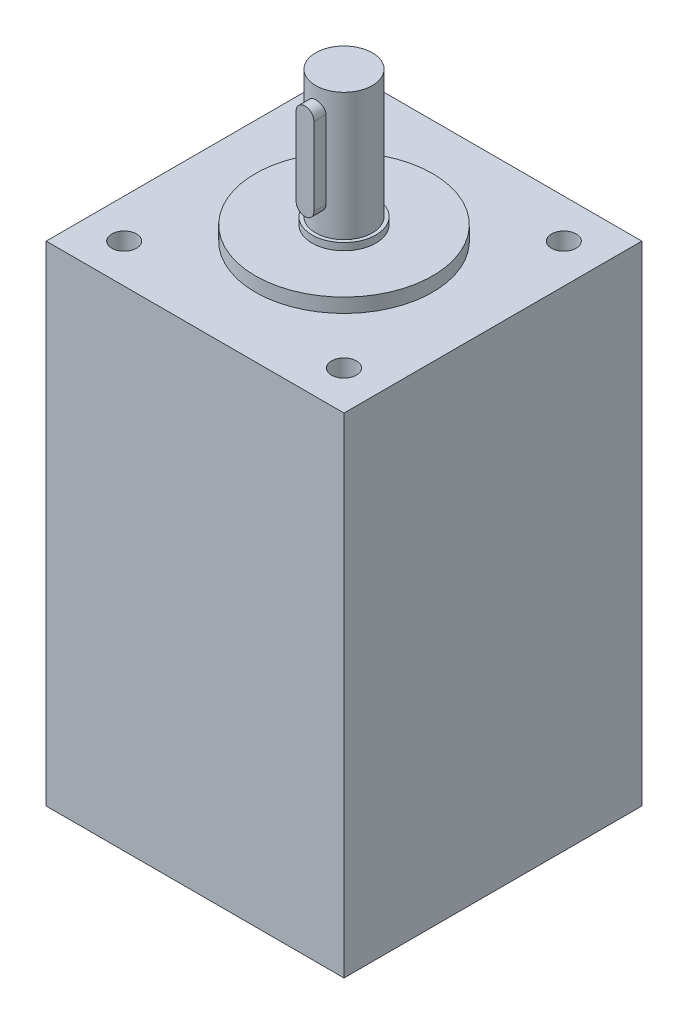
ISO-10303-21;
HEADER;
FILE_DESCRIPTION(('STEP AP214'),'2;1');
FILE_NAME('part.step','',(''),(''),'','','');
FILE_SCHEMA(('AUTOMOTIVE_DESIGN { 1 0 10303 214 1 1 1 1 }'));
ENDSEC;
DATA;
#1=APPLICATION_CONTEXT('core data for automotive mechanical design processes');
#2=APPLICATION_PROTOCOL_DEFINITION('international standard','automotive_design',2000,#1);
#3=PRODUCT_CONTEXT('',#1,'mechanical');
#4=PRODUCT('Part','Part','',(#3));
#5=PRODUCT_RELATED_PRODUCT_CATEGORY('part','',(#4));
#6=PRODUCT_DEFINITION_FORMATION('','',#4);
#7=PRODUCT_DEFINITION_CONTEXT('part definition',#1,'design');
#8=PRODUCT_DEFINITION('design','',#6,#7);
#9=PRODUCT_DEFINITION_SHAPE('','',#8);
#10=(LENGTH_UNIT() NAMED_UNIT(*) SI_UNIT(.MILLI.,.METRE.));
#11=(NAMED_UNIT(*) PLANE_ANGLE_UNIT() SI_UNIT($,.RADIAN.));
#12=(NAMED_UNIT(*) SI_UNIT($,.STERADIAN.) SOLID_ANGLE_UNIT());
#13=UNCERTAINTY_MEASURE_WITH_UNIT(LENGTH_MEASURE(1.E-05),#10,'distance_accuracy_value','');
#14=(GEOMETRIC_REPRESENTATION_CONTEXT(3) GLOBAL_UNCERTAINTY_ASSIGNED_CONTEXT((#13)) GLOBAL_UNIT_ASSIGNED_CONTEXT((#10,
#11,#12)) REPRESENTATION_CONTEXT('',''));
#15=CARTESIAN_POINT('',(0.,0.,0.));
#16=DIRECTION('',(0.,0.,1.));
#17=DIRECTION('',(1.,0.,0.));
#18=AXIS2_PLACEMENT_3D('',#15,#16,#17);
#19=CARTESIAN_POINT('',(0.,69.,0.));
#20=DIRECTION('',(1.,0.,0.));
#21=DIRECTION('',(0.,0.,-1.));
#22=AXIS2_PLACEMENT_3D('',#19,#20,#21);
#23=PLANE('',#22);
#24=DIRECTION('',(0.,0.,1.));
#25=VECTOR('',#24,1.);
#26=CARTESIAN_POINT('',(0.,0.,0.));
#27=LINE('',#26,#25);
#28=CARTESIAN_POINT('',(0.,0.,-42.));
#29=VERTEX_POINT('',#28);
#30=CARTESIAN_POINT('',(0.,0.,0.));
#31=VERTEX_POINT('',#30);
#32=EDGE_CURVE('E165',#29,#31,#27,.T.);
#33=ORIENTED_EDGE('',*,*,#32,.T.);
#34=DIRECTION('',(0.,-1.,0.));
#35=VECTOR('',#34,1.);
#36=CARTESIAN_POINT('',(0.,69.,0.));
#37=LINE('',#36,#35);
#38=CARTESIAN_POINT('',(0.,69.,0.));
#39=VERTEX_POINT('',#38);
#40=EDGE_CURVE('E168',#39,#31,#37,.T.);
#41=ORIENTED_EDGE('',*,*,#40,.F.);
#42=DIRECTION('',(0.,0.,1.));
#43=VECTOR('',#42,1.);
#44=CARTESIAN_POINT('',(0.,69.,0.));
#45=LINE('',#44,#43);
#46=CARTESIAN_POINT('',(0.,69.,-42.));
#47=VERTEX_POINT('',#46);
#48=EDGE_CURVE('E169',#47,#39,#45,.T.);
#49=ORIENTED_EDGE('',*,*,#48,.F.);
#50=DIRECTION('',(0.,-1.,0.));
#51=VECTOR('',#50,1.);
#52=CARTESIAN_POINT('',(0.,69.,-42.));
#53=LINE('',#52,#51);
#54=EDGE_CURVE('E175',#47,#29,#53,.T.);
#55=ORIENTED_EDGE('',*,*,#54,.T.);
#56=EDGE_LOOP('',(#33,#41,#49,#55));
#57=FACE_BOUND('',#56,.T.);
#58=ADVANCED_FACE('F39',(#57),#23,.F.);
#59=CARTESIAN_POINT('',(0.,69.,0.));
#60=DIRECTION('',(0.,0.,-1.));
#61=DIRECTION('',(-1.,0.,0.));
#62=AXIS2_PLACEMENT_3D('',#59,#60,#61);
#63=PLANE('',#62);
#64=DIRECTION('',(1.,0.,0.));
#65=VECTOR('',#64,1.);
#66=CARTESIAN_POINT('',(0.,0.,0.));
#67=LINE('',#66,#65);
#68=CARTESIAN_POINT('',(42.,0.,0.));
#69=VERTEX_POINT('',#68);
#70=EDGE_CURVE('E178',#31,#69,#67,.T.);
#71=ORIENTED_EDGE('',*,*,#70,.T.);
#72=DIRECTION('',(0.,-1.,0.));
#73=VECTOR('',#72,1.);
#74=CARTESIAN_POINT('',(42.,69.,0.));
#75=LINE('',#74,#73);
#76=CARTESIAN_POINT('',(42.,69.,0.));
#77=VERTEX_POINT('',#76);
#78=EDGE_CURVE('E186',#77,#69,#75,.T.);
#79=ORIENTED_EDGE('',*,*,#78,.F.);
#80=DIRECTION('',(1.,0.,0.));
#81=VECTOR('',#80,1.);
#82=CARTESIAN_POINT('',(0.,69.,0.));
#83=LINE('',#82,#81);
#84=EDGE_CURVE('E93',#39,#77,#83,.T.);
#85=ORIENTED_EDGE('',*,*,#84,.F.);
#86=ORIENTED_EDGE('',*,*,#40,.T.);
#87=EDGE_LOOP('',(#71,#79,#85,#86));
#88=FACE_BOUND('',#87,.T.);
#89=ADVANCED_FACE('F252',(#88),#63,.F.);
#90=CARTESIAN_POINT('',(42.,69.,0.));
#91=DIRECTION('',(-1.,0.,0.));
#92=DIRECTION('',(0.,0.,1.));
#93=AXIS2_PLACEMENT_3D('',#90,#91,#92);
#94=PLANE('',#93);
#95=DIRECTION('',(0.,0.,-1.));
#96=VECTOR('',#95,1.);
#97=CARTESIAN_POINT('',(42.,0.,0.));
#98=LINE('',#97,#96);
#99=CARTESIAN_POINT('',(42.,0.,-42.));
#100=VERTEX_POINT('',#99);
#101=EDGE_CURVE('E180',#69,#100,#98,.T.);
#102=ORIENTED_EDGE('',*,*,#101,.T.);
#103=DIRECTION('',(0.,-1.,0.));
#104=VECTOR('',#103,1.);
#105=CARTESIAN_POINT('',(42.,69.,-42.));
#106=LINE('',#105,#104);
#107=CARTESIAN_POINT('',(42.,69.,-42.));
#108=VERTEX_POINT('',#107);
#109=EDGE_CURVE('E184',#108,#100,#106,.T.);
#110=ORIENTED_EDGE('',*,*,#109,.F.);
#111=DIRECTION('',(0.,0.,-1.));
#112=VECTOR('',#111,1.);
#113=CARTESIAN_POINT('',(42.,69.,0.));
#114=LINE('',#113,#112);
#115=EDGE_CURVE('E172',#77,#108,#114,.T.);
#116=ORIENTED_EDGE('',*,*,#115,.F.);
#117=ORIENTED_EDGE('',*,*,#78,.T.);
#118=EDGE_LOOP('',(#102,#110,#116,#117));
#119=FACE_BOUND('',#118,.T.);
#120=ADVANCED_FACE('F251',(#119),#94,.F.);
#121=CARTESIAN_POINT('',(0.,69.,-42.));
#122=DIRECTION('',(0.,0.,1.));
#123=DIRECTION('',(1.,0.,0.));
#124=AXIS2_PLACEMENT_3D('',#121,#122,#123);
#125=PLANE('',#124);
#126=DIRECTION('',(-1.,0.,0.));
#127=VECTOR('',#126,1.);
#128=CARTESIAN_POINT('',(0.,0.,-42.));
#129=LINE('',#128,#127);
#130=EDGE_CURVE('E85',#100,#29,#129,.T.);
#131=ORIENTED_EDGE('',*,*,#130,.T.);
#132=ORIENTED_EDGE('',*,*,#54,.F.);
#133=DIRECTION('',(-1.,0.,0.));
#134=VECTOR('',#133,1.);
#135=CARTESIAN_POINT('',(0.,69.,-42.));
#136=LINE('',#135,#134);
#137=EDGE_CURVE('E64',#108,#47,#136,.T.);
#138=ORIENTED_EDGE('',*,*,#137,.F.);
#139=ORIENTED_EDGE('',*,*,#109,.T.);
#140=EDGE_LOOP('',(#131,#132,#138,#139));
#141=FACE_BOUND('',#140,.T.);
#142=ADVANCED_FACE('F247',(#141),#125,.F.);
#143=CARTESIAN_POINT('',(0.,69.,0.));
#144=DIRECTION('',(0.,-1.,0.));
#145=DIRECTION('',(0.,0.,-1.));
#146=AXIS2_PLACEMENT_3D('',#143,#144,#145);
#147=PLANE('',#146);
#148=CARTESIAN_POINT('',(5.5,69.,-5.50000000000001));
#149=DIRECTION('',(0.,1.,0.));
#150=DIRECTION('',(0.,0.,-1.));
#151=AXIS2_PLACEMENT_3D('',#148,#149,#150);
#152=CIRCLE('',#151,1.75);
#153=CARTESIAN_POINT('',(5.5,69.,-7.25000000000001));
#154=VERTEX_POINT('',#153);
#155=EDGE_CURVE('E484',#154,#154,#152,.T.);
#156=ORIENTED_EDGE('',*,*,#155,.F.);
#157=EDGE_LOOP('',(#156));
#158=FACE_BOUND('',#157,.T.);
#159=CARTESIAN_POINT('',(36.5,69.,-5.50000000000001));
#160=DIRECTION('',(0.,1.,0.));
#161=DIRECTION('',(0.,0.,1.));
#162=AXIS2_PLACEMENT_3D('',#159,#160,#161);
#163=CIRCLE('',#162,1.75);
#164=CARTESIAN_POINT('',(36.5,69.,-3.75000000000001));
#165=VERTEX_POINT('',#164);
#166=EDGE_CURVE('E485',#165,#165,#163,.T.);
#167=ORIENTED_EDGE('',*,*,#166,.F.);
#168=EDGE_LOOP('',(#167));
#169=FACE_BOUND('',#168,.T.);
#170=CARTESIAN_POINT('',(36.5,69.,-36.5));
#171=DIRECTION('',(0.,1.,0.));
#172=DIRECTION('',(0.,0.,-1.));
#173=AXIS2_PLACEMENT_3D('',#170,#171,#172);
#174=CIRCLE('',#173,1.75);
#175=CARTESIAN_POINT('',(36.5,69.,-38.25));
#176=VERTEX_POINT('',#175);
#177=EDGE_CURVE('E487',#176,#176,#174,.T.);
#178=ORIENTED_EDGE('',*,*,#177,.F.);
#179=EDGE_LOOP('',(#178));
#180=FACE_BOUND('',#179,.T.);
#181=CARTESIAN_POINT('',(5.5,69.,-36.5));
#182=DIRECTION('',(0.,1.,0.));
#183=DIRECTION('',(0.,0.,1.));
#184=AXIS2_PLACEMENT_3D('',#181,#182,#183);
#185=CIRCLE('',#184,1.75);
#186=CARTESIAN_POINT('',(5.5,69.,-34.75));
#187=VERTEX_POINT('',#186);
#188=EDGE_CURVE('E138',#187,#187,#185,.T.);
#189=ORIENTED_EDGE('',*,*,#188,.F.);
#190=EDGE_LOOP('',(#189));
#191=FACE_BOUND('',#190,.T.);
#192=CARTESIAN_POINT('',(21.,69.,-21.));
#193=DIRECTION('',(0.,1.,0.));
#194=DIRECTION('',(0.,0.,1.));
#195=AXIS2_PLACEMENT_3D('',#192,#193,#194);
#196=CIRCLE('',#195,12.5);
#197=CARTESIAN_POINT('',(21.,69.,-8.50000000000001));
#198=VERTEX_POINT('',#197);
#199=EDGE_CURVE('E162',#198,#198,#196,.T.);
#200=ORIENTED_EDGE('',*,*,#199,.F.);
#201=EDGE_LOOP('',(#200));
#202=FACE_BOUND('',#201,.T.);
#203=ORIENTED_EDGE('',*,*,#48,.T.);
#204=ORIENTED_EDGE('',*,*,#84,.T.);
#205=ORIENTED_EDGE('',*,*,#115,.T.);
#206=ORIENTED_EDGE('',*,*,#137,.T.);
#207=EDGE_LOOP('',(#203,#204,#205,#206));
#208=FACE_BOUND('',#207,.T.);
#209=ADVANCED_FACE('F235',(#158,#169,#180,#191,#202,#208),#147,.F.);
#210=CARTESIAN_POINT('',(0.,0.,0.));
#211=DIRECTION('',(0.,-1.,0.));
#212=DIRECTION('',(0.,0.,-1.));
#213=AXIS2_PLACEMENT_3D('',#210,#211,#212);
#214=PLANE('',#213);
#215=CARTESIAN_POINT('',(5.5,0.,-5.50000000000001));
#216=DIRECTION('',(0.,-1.,0.));
#217=DIRECTION('',(0.,0.,-1.));
#218=AXIS2_PLACEMENT_3D('',#215,#216,#217);
#219=CIRCLE('',#218,1.75);
#220=CARTESIAN_POINT('',(5.5,0.,-7.25000000000001));
#221=VERTEX_POINT('',#220);
#222=EDGE_CURVE('E42',#221,#221,#219,.T.);
#223=ORIENTED_EDGE('',*,*,#222,.F.);
#224=EDGE_LOOP('',(#223));
#225=FACE_BOUND('',#224,.T.);
#226=CARTESIAN_POINT('',(36.5,0.,-5.50000000000001));
#227=DIRECTION('',(0.,-1.,0.));
#228=DIRECTION('',(0.,0.,-1.));
#229=AXIS2_PLACEMENT_3D('',#226,#227,#228);
#230=CIRCLE('',#229,1.75);
#231=CARTESIAN_POINT('',(36.5,0.,-7.25000000000002));
#232=VERTEX_POINT('',#231);
#233=EDGE_CURVE('E136',#232,#232,#230,.T.);
#234=ORIENTED_EDGE('',*,*,#233,.F.);
#235=EDGE_LOOP('',(#234));
#236=FACE_BOUND('',#235,.T.);
#237=CARTESIAN_POINT('',(36.5,0.,-36.5));
#238=DIRECTION('',(0.,-1.,0.));
#239=DIRECTION('',(0.,0.,-1.));
#240=AXIS2_PLACEMENT_3D('',#237,#238,#239);
#241=CIRCLE('',#240,1.75);
#242=CARTESIAN_POINT('',(36.5,0.,-38.25));
#243=VERTEX_POINT('',#242);
#244=EDGE_CURVE('E223',#243,#243,#241,.T.);
#245=ORIENTED_EDGE('',*,*,#244,.F.);
#246=EDGE_LOOP('',(#245));
#247=FACE_BOUND('',#246,.T.);
#248=CARTESIAN_POINT('',(5.5,0.,-36.5));
#249=DIRECTION('',(0.,-1.,0.));
#250=DIRECTION('',(0.,0.,-1.));
#251=AXIS2_PLACEMENT_3D('',#248,#249,#250);
#252=CIRCLE('',#251,1.75);
#253=CARTESIAN_POINT('',(5.5,0.,-38.25));
#254=VERTEX_POINT('',#253);
#255=EDGE_CURVE('E220',#254,#254,#252,.T.);
#256=ORIENTED_EDGE('',*,*,#255,.F.);
#257=EDGE_LOOP('',(#256));
#258=FACE_BOUND('',#257,.T.);
#259=ORIENTED_EDGE('',*,*,#32,.F.);
#260=ORIENTED_EDGE('',*,*,#130,.F.);
#261=ORIENTED_EDGE('',*,*,#101,.F.);
#262=ORIENTED_EDGE('',*,*,#70,.F.);
#263=EDGE_LOOP('',(#259,#260,#261,#262));
#264=FACE_BOUND('',#263,.T.);
#265=ADVANCED_FACE('F231',(#225,#236,#247,#258,#264),#214,.T.);
#266=CARTESIAN_POINT('',(21.,71.,-21.));
#267=DIRECTION('',(0.,-1.,0.));
#268=DIRECTION('',(0.,0.,-1.));
#269=AXIS2_PLACEMENT_3D('',#266,#267,#268);
#270=CYLINDRICAL_SURFACE('',#269,12.5);
#271=CARTESIAN_POINT('',(21.,71.,-21.));
#272=DIRECTION('',(0.,1.,0.));
#273=DIRECTION('',(0.,0.,1.));
#274=AXIS2_PLACEMENT_3D('',#271,#272,#273);
#275=CIRCLE('',#274,12.5);
#276=CARTESIAN_POINT('',(21.,71.,-8.50000000000001));
#277=VERTEX_POINT('',#276);
#278=EDGE_CURVE('E159',#277,#277,#275,.T.);
#279=ORIENTED_EDGE('',*,*,#278,.F.);
#280=EDGE_LOOP('',(#279));
#281=FACE_BOUND('',#280,.T.);
#282=ORIENTED_EDGE('',*,*,#199,.T.);
#283=EDGE_LOOP('',(#282));
#284=FACE_BOUND('',#283,.T.);
#285=ADVANCED_FACE('F234',(#281,#284),#270,.T.);
#286=CARTESIAN_POINT('',(21.,71.,-21.));
#287=DIRECTION('',(0.,1.,0.));
#288=DIRECTION('',(0.,0.,1.));
#289=AXIS2_PLACEMENT_3D('',#286,#287,#288);
#290=PLANE('',#289);
#291=CARTESIAN_POINT('',(21.,71.,-21.));
#292=DIRECTION('',(0.,1.,0.));
#293=DIRECTION('',(0.,0.,1.));
#294=AXIS2_PLACEMENT_3D('',#291,#292,#293);
#295=CIRCLE('',#294,4.5);
#296=CARTESIAN_POINT('',(21.,71.,-16.5));
#297=VERTEX_POINT('',#296);
#298=EDGE_CURVE('E156',#297,#297,#295,.T.);
#299=ORIENTED_EDGE('',*,*,#298,.F.);
#300=EDGE_LOOP('',(#299));
#301=FACE_BOUND('',#300,.T.);
#302=ORIENTED_EDGE('',*,*,#278,.T.);
#303=EDGE_LOOP('',(#302));
#304=FACE_BOUND('',#303,.T.);
#305=ADVANCED_FACE('F267',(#301,#304),#290,.T.);
#306=CARTESIAN_POINT('',(21.,72.,-21.));
#307=DIRECTION('',(0.,-1.,0.));
#308=DIRECTION('',(0.,0.,-1.));
#309=AXIS2_PLACEMENT_3D('',#306,#307,#308);
#310=CYLINDRICAL_SURFACE('',#309,4.5);
#311=CARTESIAN_POINT('',(21.,72.,-21.));
#312=DIRECTION('',(0.,1.,0.));
#313=DIRECTION('',(0.,0.,1.));
#314=AXIS2_PLACEMENT_3D('',#311,#312,#313);
#315=CIRCLE('',#314,4.5);
#316=CARTESIAN_POINT('',(21.,72.,-16.5));
#317=VERTEX_POINT('',#316);
#318=EDGE_CURVE('E151',#317,#317,#315,.T.);
#319=ORIENTED_EDGE('',*,*,#318,.F.);
#320=EDGE_LOOP('',(#319));
#321=FACE_BOUND('',#320,.T.);
#322=ORIENTED_EDGE('',*,*,#298,.T.);
#323=EDGE_LOOP('',(#322));
#324=FACE_BOUND('',#323,.T.);
#325=ADVANCED_FACE('F271',(#321,#324),#310,.T.);
#326=CARTESIAN_POINT('',(21.,72.,-21.));
#327=DIRECTION('',(0.,1.,0.));
#328=DIRECTION('',(0.,0.,1.));
#329=AXIS2_PLACEMENT_3D('',#326,#327,#328);
#330=PLANE('',#329);
#331=CARTESIAN_POINT('',(21.,72.,-21.));
#332=DIRECTION('',(0.,1.,0.));
#333=DIRECTION('',(0.,0.,1.));
#334=AXIS2_PLACEMENT_3D('',#331,#332,#333);
#335=CIRCLE('',#334,4.);
#336=CARTESIAN_POINT('',(21.,72.,-17.));
#337=VERTEX_POINT('',#336);
#338=EDGE_CURVE('E152',#337,#337,#335,.T.);
#339=ORIENTED_EDGE('',*,*,#338,.F.);
#340=EDGE_LOOP('',(#339));
#341=FACE_BOUND('',#340,.T.);
#342=ORIENTED_EDGE('',*,*,#318,.T.);
#343=EDGE_LOOP('',(#342));
#344=FACE_BOUND('',#343,.T.);
#345=ADVANCED_FACE('F274',(#341,#344),#330,.T.);
#346=CARTESIAN_POINT('',(21.,90.,-21.));
#347=DIRECTION('',(0.,-1.,0.));
#348=DIRECTION('',(0.,0.,-1.));
#349=AXIS2_PLACEMENT_3D('',#346,#347,#348);
#350=CYLINDRICAL_SURFACE('',#349,4.);
#351=DIRECTION('',(0.,-1.,0.));
#352=VECTOR('',#351,1.);
#353=CARTESIAN_POINT('',(19.7451485693752,90.,-17.2019283989031));
#354=LINE('',#353,#352);
#355=CARTESIAN_POINT('',(19.7451485693752,76.,-17.2019283989031));
#356=VERTEX_POINT('',#355);
#357=CARTESIAN_POINT('',(19.7451485693752,87.,-17.2019283989031));
#358=VERTEX_POINT('',#357);
#359=EDGE_CURVE('E155',#356,#358,#354,.F.);
#360=ORIENTED_EDGE('',*,*,#359,.T.);
#361=CARTESIAN_POINT('',(22.2548514306248,87.,-17.2019283989031));
#362=CARTESIAN_POINT('',(22.2548510076971,86.9314025017576,-17.2019280077231));
#363=CARTESIAN_POINT('',(22.2492074284182,86.8628006628783,-17.2000496435417));
#364=CARTESIAN_POINT('',(22.2268474559461,86.7276133721324,-17.1927726795756));
#365=CARTESIAN_POINT('',(22.2101281390364,86.6610284575376,-17.1873731502975));
#366=CARTESIAN_POINT('',(22.1662489106781,86.5318528530891,-17.1737243018151));
#367=CARTESIAN_POINT('',(22.1391075850232,86.4692552828904,-17.1654800582899));
#368=CARTESIAN_POINT('',(22.0752168839291,86.3494845430403,-17.1470777698554));
#369=CARTESIAN_POINT('',(22.0384657861454,86.2923123482766,-17.1369193819683));
#370=CARTESIAN_POINT('',(21.9550361559735,86.1830359044051,-17.1154389447144));
#371=CARTESIAN_POINT('',(21.9080821753213,86.1311471150295,-17.1040903747683));
#372=CARTESIAN_POINT('',(21.8061689498582,86.0358358278152,-17.0817338479075));
#373=CARTESIAN_POINT('',(21.7512085800784,85.9924145217415,-17.0707259391227));
#374=CARTESIAN_POINT('',(21.6332928394617,85.9143184815162,-17.0499874575148));
#375=CARTESIAN_POINT('',(21.5701836942455,85.8798658565649,-17.0402917494172));
#376=CARTESIAN_POINT('',(21.4387106836485,85.8221479407846,-17.0235799666477));
#377=CARTESIAN_POINT('',(21.3703480679716,85.7988799988219,-17.0165632570474));
#378=CARTESIAN_POINT('',(21.2325648254133,85.7649119803921,-17.0061877891637));
#379=CARTESIAN_POINT('',(21.1632431993916,85.7538435991747,-17.0027220699658));
#380=CARTESIAN_POINT('',(21.0236459387936,85.7434217159415,-16.999461199698));
#381=CARTESIAN_POINT('',(20.9533705264032,85.744065530816,-16.999665207942));
#382=CARTESIAN_POINT('',(20.8164535609773,85.756807970105,-17.0036464425257));
#383=CARTESIAN_POINT('',(20.7497706445706,85.7685072917916,-17.0072991063602));
#384=CARTESIAN_POINT('',(20.6193674707329,85.8023731692894,-17.0176138544112));
#385=CARTESIAN_POINT('',(20.5556474073189,85.8245404095161,-17.0242761354017));
#386=CARTESIAN_POINT('',(20.432060158524,85.8789680950992,-17.0400282618756));
#387=CARTESIAN_POINT('',(20.3722499759235,85.9113492841755,-17.0491469468435));
#388=CARTESIAN_POINT('',(20.2587884107593,85.9851886756804,-17.0688517778303));
#389=CARTESIAN_POINT('',(20.2051386001482,86.0266491870835,-17.0794382968843));
#390=CARTESIAN_POINT('',(20.1031400182846,86.1195182445489,-17.1014771269303));
#391=CARTESIAN_POINT('',(20.055108359805,86.1712713601979,-17.1129471269657));
#392=CARTESIAN_POINT('',(19.9683107849442,86.2822046100731,-17.1350771168726));
#393=CARTESIAN_POINT('',(19.9295459776963,86.3413856320411,-17.1457370096797));
#394=CARTESIAN_POINT('',(19.8620096670831,86.4663968644005,-17.1651295014488));
#395=CARTESIAN_POINT('',(19.8333565281485,86.5322948931996,-17.1738388630348));
#396=CARTESIAN_POINT('',(19.7876538502749,86.6683198209032,-17.1880718212862));
#397=CARTESIAN_POINT('',(19.770600103765,86.7384451763252,-17.193596573028));
#398=CARTESIAN_POINT('',(19.749194000783,86.8778940445251,-17.2005781028202));
#399=CARTESIAN_POINT('',(19.7443556979977,86.9471352187903,-17.2021904158905));
#400=CARTESIAN_POINT('',(19.746152925018,87.0854451603328,-17.2015965125429));
#401=CARTESIAN_POINT('',(19.7527866649873,87.1545139528208,-17.1993908917885));
#402=CARTESIAN_POINT('',(19.776905245254,87.2884197871557,-17.1915632820957));
#403=CARTESIAN_POINT('',(19.7940674212281,87.3533215080429,-17.1860429809193));
#404=CARTESIAN_POINT('',(19.8383763975075,87.4793165771696,-17.1723159824303));
#405=CARTESIAN_POINT('',(19.8655248346307,87.5404092991666,-17.1641088447509));
#406=CARTESIAN_POINT('',(19.9299295046433,87.6590033055538,-17.1456389428064));
#407=CARTESIAN_POINT('',(19.9674548061946,87.7163500822859,-17.1353236945109));
#408=CARTESIAN_POINT('',(20.0512344075225,87.824109596224,-17.1139081134519));
#409=CARTESIAN_POINT('',(20.0974909923903,87.8745205122398,-17.1028075756446));
#410=CARTESIAN_POINT('',(20.1997207128226,87.9691520380372,-17.0805105083099));
#411=CARTESIAN_POINT('',(20.2560192664983,88.0130256571187,-17.069329374103));
#412=CARTESIAN_POINT('',(20.3754503269506,88.0907169550484,-17.0485944700002));
#413=CARTESIAN_POINT('',(20.4385825236713,88.124535089873,-17.0390406263216));
#414=CARTESIAN_POINT('',(20.5695034918161,88.1808315622422,-17.0226908626561));
#415=CARTESIAN_POINT('',(20.6372545091695,88.2033916487806,-17.0158751329105));
#416=CARTESIAN_POINT('',(20.7758408653886,88.236721343425,-17.0056824773655));
#417=CARTESIAN_POINT('',(20.8466752234608,88.2474946727442,-17.0023044662628));
#418=CARTESIAN_POINT('',(20.9862246139922,88.2566408687772,-16.9994403370757));
#419=CARTESIAN_POINT('',(21.0549039679829,88.2555147645123,-16.9997969650812));
#420=CARTESIAN_POINT('',(21.1910506492713,88.2421070599648,-17.0039847833683));
#421=CARTESIAN_POINT('',(21.2585180563407,88.2298261966646,-17.0078157441045));
#422=CARTESIAN_POINT('',(21.3894838197575,88.1947774241575,-17.0184715606523));
#423=CARTESIAN_POINT('',(21.4530216745938,88.1721445537192,-17.025257812596));
#424=CARTESIAN_POINT('',(21.5754284967597,88.1171563652379,-17.0411244598342));
#425=CARTESIAN_POINT('',(21.6342966581051,88.0847993734165,-17.0502052500366));
#426=CARTESIAN_POINT('',(21.7478776277273,88.0100056062433,-17.0700994405475));
#427=CARTESIAN_POINT('',(21.8023802756065,87.9672627253127,-17.0809613650403));
#428=CARTESIAN_POINT('',(21.9036055976567,87.8734492709564,-17.1030542309684));
#429=CARTESIAN_POINT('',(21.9503259267689,87.8223761965225,-17.1142852824171));
#430=CARTESIAN_POINT('',(22.0362388012747,87.7113037862436,-17.1362913214459));
#431=CARTESIAN_POINT('',(22.0751271052061,87.6510629291876,-17.147038468921));
#432=CARTESIAN_POINT('',(22.1421863838066,87.5245770440211,-17.1663809587386));
#433=CARTESIAN_POINT('',(22.1703616100532,87.4583344107186,-17.174977154241));
#434=CARTESIAN_POINT('',(22.213186728485,87.3273761895562,-17.1883546710163));
#435=CARTESIAN_POINT('',(22.2287648079051,87.2629898639875,-17.1933933222814));
#436=CARTESIAN_POINT('',(22.2495960656978,87.132403399895,-17.2001799615079));
#437=CARTESIAN_POINT('',(22.2548518387942,87.066203721438,-17.2019287764325));
#438=CARTESIAN_POINT('',(22.2548514306248,87.,-17.2019283989031));
#439=B_SPLINE_CURVE_WITH_KNOTS('',3,(#361,#362,#363,#364,#365,#366,#367,#368,#369,#370,#371,
#372,#373,#374,#375,#376,#377,#378,#379,#380,#381,#382,#383,#384,#385,#386,#387,#388,#389,#390,
#391,#392,#393,#394,#395,#396,#397,#398,#399,#400,#401,#402,#403,#404,#405,#406,#407,#408,#409,
#410,#411,#412,#413,#414,#415,#416,#417,#418,#419,#420,#421,#422,#423,#424,#425,#426,#427,#428,
#429,#430,#431,#432,#433,#434,#435,#436,#437,#438),.UNSPECIFIED.,.T.,.F.,(4,2,2,2,2,2,2,2,2,2,2,
2,2,2,2,2,2,2,2,2,2,2,2,2,2,2,2,2,2,2,2,2,2,2,2,2,2,2,4),(0.,0.205547907287991,
0.411150095691636,0.616387319412503,0.821661352726282,1.03337996507,1.24512835450256,
1.46170688178865,1.67823404757304,1.88802820917951,2.09777431031728,2.30022315004718,
2.50268522816052,2.70763655035463,2.91264005464588,3.12625017021235,3.33988583961748,
3.55594522568435,3.771926196377,3.97916923987076,4.18637995280127,4.38753723665012,
4.58872750628429,4.7957234109584,5.00277356447218,5.21848151715834,5.43417968685105,
5.64828793055633,5.86232855833278,6.06739411849258,6.27244613118722,6.47489640423647,
6.67738154430628,6.88677168468943,7.09622480725021,7.31268731379778,7.52906382544085,
7.72748882201967,7.92586393401223),.UNSPECIFIED.);
#440=CARTESIAN_POINT('',(22.2548514306248,87.,-17.2019283989031));
#441=VERTEX_POINT('',#440);
#442=EDGE_CURVE('E11',#358,#441,#439,.T.);
#443=ORIENTED_EDGE('',*,*,#442,.T.);
#444=DIRECTION('',(0.,-1.,0.));
#445=VECTOR('',#444,1.);
#446=CARTESIAN_POINT('',(22.2548514306248,90.,-17.2019283989031));
#447=LINE('',#446,#445);
#448=CARTESIAN_POINT('',(22.2548514306248,76.,-17.2019283989031));
#449=VERTEX_POINT('',#448);
#450=EDGE_CURVE('E47',#441,#449,#447,.T.);
#451=ORIENTED_EDGE('',*,*,#450,.T.);
#452=CARTESIAN_POINT('',(22.2548514306249,76.,-17.2019283989031));
#453=CARTESIAN_POINT('',(22.2548510076971,75.9314025017576,-17.2019280077231));
#454=CARTESIAN_POINT('',(22.2492074284182,75.8628006628783,-17.2000496435417));
#455=CARTESIAN_POINT('',(22.2268474559461,75.7276133721324,-17.1927726795756));
#456=CARTESIAN_POINT('',(22.2101281390364,75.6610284575376,-17.1873731502975));
#457=CARTESIAN_POINT('',(22.1662489106781,75.5318528530891,-17.1737243018151));
#458=CARTESIAN_POINT('',(22.1391075850232,75.4692552828904,-17.1654800582899));
#459=CARTESIAN_POINT('',(22.0752168839291,75.3494845430403,-17.1470777698554));
#460=CARTESIAN_POINT('',(22.0384657861454,75.2923123482766,-17.1369193819683));
#461=CARTESIAN_POINT('',(21.9550361559735,75.1830359044051,-17.1154389447144));
#462=CARTESIAN_POINT('',(21.9080821753214,75.1311471150295,-17.1040903747683));
#463=CARTESIAN_POINT('',(21.8061689498582,75.0358358278152,-17.0817338479075));
#464=CARTESIAN_POINT('',(21.7512085800784,74.9924145217415,-17.0707259391227));
#465=CARTESIAN_POINT('',(21.6332928394617,74.9143184815162,-17.0499874575148));
#466=CARTESIAN_POINT('',(21.5701836942455,74.8798658565649,-17.0402917494172));
#467=CARTESIAN_POINT('',(21.4387106836485,74.8221479407846,-17.0235799666477));
#468=CARTESIAN_POINT('',(21.3703480679716,74.7988799988219,-17.0165632570474));
#469=CARTESIAN_POINT('',(21.2325648254133,74.7649119803921,-17.0061877891637));
#470=CARTESIAN_POINT('',(21.1632431993916,74.7538435991747,-17.0027220699658));
#471=CARTESIAN_POINT('',(21.0236459387936,74.7434217159415,-16.999461199698));
#472=CARTESIAN_POINT('',(20.9533705264032,74.744065530816,-16.999665207942));
#473=CARTESIAN_POINT('',(20.8164535609773,74.756807970105,-17.0036464425257));
#474=CARTESIAN_POINT('',(20.7497706445706,74.7685072917916,-17.0072991063602));
#475=CARTESIAN_POINT('',(20.6193674707329,74.8023731692894,-17.0176138544112));
#476=CARTESIAN_POINT('',(20.5556474073189,74.8245404095161,-17.0242761354017));
#477=CARTESIAN_POINT('',(20.432060158524,74.8789680950992,-17.0400282618756));
#478=CARTESIAN_POINT('',(20.3722499759235,74.9113492841755,-17.0491469468435));
#479=CARTESIAN_POINT('',(20.2587884107593,74.9851886756804,-17.0688517778303));
#480=CARTESIAN_POINT('',(20.2051386001482,75.0266491870835,-17.0794382968843));
#481=CARTESIAN_POINT('',(20.1031400182846,75.1195182445489,-17.1014771269303));
#482=CARTESIAN_POINT('',(20.055108359805,75.1712713601979,-17.1129471269657));
#483=CARTESIAN_POINT('',(19.9683107849442,75.2822046100731,-17.1350771168726));
#484=CARTESIAN_POINT('',(19.9295459776963,75.3413856320411,-17.1457370096797));
#485=CARTESIAN_POINT('',(19.8620096670831,75.4663968644005,-17.1651295014488));
#486=CARTESIAN_POINT('',(19.8333565281485,75.5322948931996,-17.1738388630348));
#487=CARTESIAN_POINT('',(19.7876538502749,75.6683198209032,-17.1880718212862));
#488=CARTESIAN_POINT('',(19.770600103765,75.7384451763252,-17.193596573028));
#489=CARTESIAN_POINT('',(19.749194000783,75.8778940445251,-17.2005781028202));
#490=CARTESIAN_POINT('',(19.7443556979977,75.9471352187904,-17.2021904158905));
#491=CARTESIAN_POINT('',(19.746152925018,76.0854451603328,-17.2015965125429));
#492=CARTESIAN_POINT('',(19.7527866649874,76.1545139528209,-17.1993908917885));
#493=CARTESIAN_POINT('',(19.776905245254,76.2884197871557,-17.1915632820957));
#494=CARTESIAN_POINT('',(19.7940674212281,76.3533215080429,-17.1860429809193));
#495=CARTESIAN_POINT('',(19.8383763975075,76.4793165771696,-17.1723159824303));
#496=CARTESIAN_POINT('',(19.8655248346307,76.5404092991666,-17.1641088447509));
#497=CARTESIAN_POINT('',(19.9299295046433,76.6590033055538,-17.1456389428064));
#498=CARTESIAN_POINT('',(19.9674548061946,76.7163500822859,-17.1353236945109));
#499=CARTESIAN_POINT('',(20.0512344075225,76.824109596224,-17.1139081134519));
#500=CARTESIAN_POINT('',(20.0974909923903,76.8745205122398,-17.1028075756446));
#501=CARTESIAN_POINT('',(20.1997207128226,76.9691520380372,-17.0805105083099));
#502=CARTESIAN_POINT('',(20.2560192664983,77.0130256571187,-17.069329374103));
#503=CARTESIAN_POINT('',(20.3754503269506,77.0907169550484,-17.0485944700002));
#504=CARTESIAN_POINT('',(20.4385825236713,77.124535089873,-17.0390406263216));
#505=CARTESIAN_POINT('',(20.5695034918161,77.1808315622423,-17.0226908626561));
#506=CARTESIAN_POINT('',(20.6372545091695,77.2033916487806,-17.0158751329105));
#507=CARTESIAN_POINT('',(20.7758408653886,77.236721343425,-17.0056824773655));
#508=CARTESIAN_POINT('',(20.8466752234608,77.2474946727442,-17.0023044662628));
#509=CARTESIAN_POINT('',(20.9862246139922,77.2566408687772,-16.9994403370757));
#510=CARTESIAN_POINT('',(21.0549039679829,77.2555147645123,-16.9997969650812));
#511=CARTESIAN_POINT('',(21.1910506492713,77.2421070599648,-17.0039847833683));
#512=CARTESIAN_POINT('',(21.2585180563407,77.2298261966646,-17.0078157441045));
#513=CARTESIAN_POINT('',(21.3894838197575,77.1947774241575,-17.0184715606523));
#514=CARTESIAN_POINT('',(21.4530216745938,77.1721445537192,-17.025257812596));
#515=CARTESIAN_POINT('',(21.5754284967597,77.1171563652379,-17.0411244598342));
#516=CARTESIAN_POINT('',(21.6342966581051,77.0847993734165,-17.0502052500366));
#517=CARTESIAN_POINT('',(21.7478776277274,77.0100056062433,-17.0700994405476));
#518=CARTESIAN_POINT('',(21.8023802756065,76.9672627253126,-17.0809613650403));
#519=CARTESIAN_POINT('',(21.9036055976567,76.8734492709564,-17.1030542309684));
#520=CARTESIAN_POINT('',(21.9503259267689,76.8223761965225,-17.1142852824171));
#521=CARTESIAN_POINT('',(22.0362388012747,76.7113037862435,-17.1362913214459));
#522=CARTESIAN_POINT('',(22.0751271052061,76.6510629291876,-17.147038468921));
#523=CARTESIAN_POINT('',(22.1421863838066,76.5245770440211,-17.1663809587386));
#524=CARTESIAN_POINT('',(22.1703616100533,76.4583344107186,-17.174977154241));
#525=CARTESIAN_POINT('',(22.213186728485,76.3273761895562,-17.1883546710163));
#526=CARTESIAN_POINT('',(22.2287648079051,76.2629898639876,-17.1933933222814));
#527=CARTESIAN_POINT('',(22.2495960656978,76.132403399895,-17.2001799615079));
#528=CARTESIAN_POINT('',(22.2548518387942,76.066203721438,-17.2019287764326));
#529=CARTESIAN_POINT('',(22.2548514306249,76.,-17.2019283989031));
#530=B_SPLINE_CURVE_WITH_KNOTS('',3,(#452,#453,#454,#455,#456,#457,#458,#459,#460,#461,#462,
#463,#464,#465,#466,#467,#468,#469,#470,#471,#472,#473,#474,#475,#476,#477,#478,#479,#480,#481,
#482,#483,#484,#485,#486,#487,#488,#489,#490,#491,#492,#493,#494,#495,#496,#497,#498,#499,#500,
#501,#502,#503,#504,#505,#506,#507,#508,#509,#510,#511,#512,#513,#514,#515,#516,#517,#518,#519,
#520,#521,#522,#523,#524,#525,#526,#527,#528,#529),.UNSPECIFIED.,.T.,.F.,(4,2,2,2,2,2,2,2,2,2,2,
2,2,2,2,2,2,2,2,2,2,2,2,2,2,2,2,2,2,2,2,2,2,2,2,2,2,2,4),(0.,0.205547907287977,
0.411150095691636,0.61638731941252,0.821661352726282,1.03337996507,1.24512835450256,
1.46170688178865,1.67823404757304,1.88802820917951,2.09777431031727,2.30022315004718,
2.50268522816053,2.70763655035463,2.91264005464589,3.12625017021237,3.33988583961749,
3.55594522568436,3.771926196377,3.97916923987078,4.18637995280128,4.38753723665011,
4.5887275062843,4.79572341095839,5.00277356447218,5.21848151715835,5.43417968685105,
5.64828793055634,5.86232855833278,6.06739411849259,6.27244613118723,6.47489640423649,
6.67738154430629,6.88677168468946,7.09622480725024,7.31268731379781,7.52906382544086,
7.72748882201966,7.92586393401224),.UNSPECIFIED.);
#531=EDGE_CURVE('E191',#449,#356,#530,.T.);
#532=ORIENTED_EDGE('',*,*,#531,.T.);
#533=EDGE_LOOP('',(#360,#443,#451,#532));
#534=FACE_BOUND('',#533,.T.);
#535=CARTESIAN_POINT('',(21.,90.,-21.));
#536=DIRECTION('',(0.,1.,0.));
#537=DIRECTION('',(0.,0.,1.));
#538=AXIS2_PLACEMENT_3D('',#535,#536,#537);
#539=CIRCLE('',#538,4.);
#540=CARTESIAN_POINT('',(21.,90.,-17.));
#541=VERTEX_POINT('',#540);
#542=EDGE_CURVE('E145',#541,#541,#539,.T.);
#543=ORIENTED_EDGE('',*,*,#542,.F.);
#544=EDGE_LOOP('',(#543));
#545=FACE_BOUND('',#544,.T.);
#546=ORIENTED_EDGE('',*,*,#338,.T.);
#547=EDGE_LOOP('',(#546));
#548=FACE_BOUND('',#547,.T.);
#549=ADVANCED_FACE('F199',(#534,#545,#548),#350,.T.);
#550=CARTESIAN_POINT('',(21.,90.,-21.));
#551=DIRECTION('',(0.,1.,0.));
#552=DIRECTION('',(0.,0.,1.));
#553=AXIS2_PLACEMENT_3D('',#550,#551,#552);
#554=PLANE('',#553);
#555=ORIENTED_EDGE('',*,*,#542,.T.);
#556=EDGE_LOOP('',(#555));
#557=FACE_BOUND('',#556,.T.);
#558=ADVANCED_FACE('F215',(#557),#554,.T.);
#559=CARTESIAN_POINT('',(21.,87.,-21.));
#560=DIRECTION('',(0.,0.,1.));
#561=DIRECTION('',(1.,0.,0.));
#562=AXIS2_PLACEMENT_3D('',#559,#560,#561);
#563=CYLINDRICAL_SURFACE('',#562,1.25485143062484);
#564=ORIENTED_EDGE('',*,*,#442,.F.);
#565=DIRECTION('',(0.,0.,1.));
#566=VECTOR('',#565,1.);
#567=CARTESIAN_POINT('',(19.7451485693752,87.,-21.));
#568=LINE('',#567,#566);
#569=CARTESIAN_POINT('',(19.7451485693752,87.,-15.5));
#570=VERTEX_POINT('',#569);
#571=EDGE_CURVE('E55',#358,#570,#568,.T.);
#572=ORIENTED_EDGE('',*,*,#571,.T.);
#573=CARTESIAN_POINT('',(21.,87.,-15.5));
#574=DIRECTION('',(0.,0.,1.));
#575=DIRECTION('',(1.,0.,0.));
#576=AXIS2_PLACEMENT_3D('',#573,#574,#575);
#577=CIRCLE('',#576,1.25485143062484);
#578=CARTESIAN_POINT('',(22.2548514306248,87.,-15.5));
#579=VERTEX_POINT('',#578);
#580=EDGE_CURVE('E117',#579,#570,#577,.T.);
#581=ORIENTED_EDGE('',*,*,#580,.F.);
#582=DIRECTION('',(0.,0.,1.));
#583=VECTOR('',#582,1.);
#584=CARTESIAN_POINT('',(22.2548514306248,87.,-21.));
#585=LINE('',#584,#583);
#586=EDGE_CURVE('E143',#441,#579,#585,.T.);
#587=ORIENTED_EDGE('',*,*,#586,.F.);
#588=EDGE_LOOP('',(#564,#572,#581,#587));
#589=FACE_BOUND('',#588,.T.);
#590=ADVANCED_FACE('F114',(#589),#563,.T.);
#591=CARTESIAN_POINT('',(22.2548514306248,87.,-21.));
#592=DIRECTION('',(1.,0.,0.));
#593=DIRECTION('',(0.,1.,0.));
#594=AXIS2_PLACEMENT_3D('',#591,#592,#593);
#595=PLANE('',#594);
#596=ORIENTED_EDGE('',*,*,#450,.F.);
#597=ORIENTED_EDGE('',*,*,#586,.T.);
#598=DIRECTION('',(0.,1.,0.));
#599=VECTOR('',#598,1.);
#600=CARTESIAN_POINT('',(22.2548514306248,87.,-15.5));
#601=LINE('',#600,#599);
#602=CARTESIAN_POINT('',(22.2548514306248,76.,-15.5));
#603=VERTEX_POINT('',#602);
#604=EDGE_CURVE('E120',#603,#579,#601,.T.);
#605=ORIENTED_EDGE('',*,*,#604,.F.);
#606=DIRECTION('',(0.,0.,1.));
#607=VECTOR('',#606,1.);
#608=CARTESIAN_POINT('',(22.2548514306248,76.,-21.));
#609=LINE('',#608,#607);
#610=EDGE_CURVE('E146',#449,#603,#609,.T.);
#611=ORIENTED_EDGE('',*,*,#610,.F.);
#612=EDGE_LOOP('',(#596,#597,#605,#611));
#613=FACE_BOUND('',#612,.T.);
#614=ADVANCED_FACE('F208',(#613),#595,.T.);
#615=CARTESIAN_POINT('',(21.,76.,-21.));
#616=DIRECTION('',(0.,0.,1.));
#617=DIRECTION('',(1.,0.,0.));
#618=AXIS2_PLACEMENT_3D('',#615,#616,#617);
#619=CYLINDRICAL_SURFACE('',#618,1.25485143062485);
#620=ORIENTED_EDGE('',*,*,#531,.F.);
#621=ORIENTED_EDGE('',*,*,#610,.T.);
#622=CARTESIAN_POINT('',(21.,76.,-15.5));
#623=DIRECTION('',(0.,0.,1.));
#624=DIRECTION('',(1.,0.,0.));
#625=AXIS2_PLACEMENT_3D('',#622,#623,#624);
#626=CIRCLE('',#625,1.25485143062485);
#627=CARTESIAN_POINT('',(19.7451485693752,76.,-15.5));
#628=VERTEX_POINT('',#627);
#629=EDGE_CURVE('E129',#628,#603,#626,.T.);
#630=ORIENTED_EDGE('',*,*,#629,.F.);
#631=DIRECTION('',(0.,0.,1.));
#632=VECTOR('',#631,1.);
#633=CARTESIAN_POINT('',(19.7451485693752,76.,-21.));
#634=LINE('',#633,#632);
#635=EDGE_CURVE('E119',#356,#628,#634,.T.);
#636=ORIENTED_EDGE('',*,*,#635,.F.);
#637=EDGE_LOOP('',(#620,#621,#630,#636));
#638=FACE_BOUND('',#637,.T.);
#639=ADVANCED_FACE('F203',(#638),#619,.T.);
#640=CARTESIAN_POINT('',(19.7451485693752,87.,-21.));
#641=DIRECTION('',(-1.,0.,0.));
#642=DIRECTION('',(0.,0.,1.));
#643=AXIS2_PLACEMENT_3D('',#640,#641,#642);
#644=PLANE('',#643);
#645=ORIENTED_EDGE('',*,*,#359,.F.);
#646=ORIENTED_EDGE('',*,*,#635,.T.);
#647=DIRECTION('',(0.,-1.,0.));
#648=VECTOR('',#647,1.);
#649=CARTESIAN_POINT('',(19.7451485693752,87.,-15.5));
#650=LINE('',#649,#648);
#651=EDGE_CURVE('E123',#570,#628,#650,.T.);
#652=ORIENTED_EDGE('',*,*,#651,.F.);
#653=ORIENTED_EDGE('',*,*,#571,.F.);
#654=EDGE_LOOP('',(#645,#646,#652,#653));
#655=FACE_BOUND('',#654,.T.);
#656=ADVANCED_FACE('F124',(#655),#644,.T.);
#657=CARTESIAN_POINT('',(21.,87.,-15.5));
#658=DIRECTION('',(0.,0.,1.));
#659=DIRECTION('',(1.,0.,0.));
#660=AXIS2_PLACEMENT_3D('',#657,#658,#659);
#661=PLANE('',#660);
#662=ORIENTED_EDGE('',*,*,#580,.T.);
#663=ORIENTED_EDGE('',*,*,#651,.T.);
#664=ORIENTED_EDGE('',*,*,#629,.T.);
#665=ORIENTED_EDGE('',*,*,#604,.T.);
#666=EDGE_LOOP('',(#662,#663,#664,#665));
#667=FACE_BOUND('',#666,.T.);
#668=ADVANCED_FACE('F132',(#667),#661,.T.);
#669=CARTESIAN_POINT('',(5.5,-2.5,-36.5));
#670=DIRECTION('',(0.,1.,0.));
#671=DIRECTION('',(0.,0.,1.));
#672=AXIS2_PLACEMENT_3D('',#669,#670,#671);
#673=CYLINDRICAL_SURFACE('',#672,1.75);
#674=ORIENTED_EDGE('',*,*,#255,.T.);
#675=EDGE_LOOP('',(#674));
#676=FACE_BOUND('',#675,.T.);
#677=ORIENTED_EDGE('',*,*,#188,.T.);
#678=EDGE_LOOP('',(#677));
#679=FACE_BOUND('',#678,.T.);
#680=ADVANCED_FACE('F321',(#676,#679),#673,.F.);
#681=CARTESIAN_POINT('',(36.5,-2.5,-36.5));
#682=DIRECTION('',(0.,1.,0.));
#683=DIRECTION('',(0.,0.,1.));
#684=AXIS2_PLACEMENT_3D('',#681,#682,#683);
#685=CYLINDRICAL_SURFACE('',#684,1.75);
#686=ORIENTED_EDGE('',*,*,#244,.T.);
#687=EDGE_LOOP('',(#686));
#688=FACE_BOUND('',#687,.T.);
#689=ORIENTED_EDGE('',*,*,#177,.T.);
#690=EDGE_LOOP('',(#689));
#691=FACE_BOUND('',#690,.T.);
#692=ADVANCED_FACE('F328',(#688,#691),#685,.F.);
#693=CARTESIAN_POINT('',(36.5,-2.5,-5.50000000000001));
#694=DIRECTION('',(0.,1.,0.));
#695=DIRECTION('',(0.,0.,1.));
#696=AXIS2_PLACEMENT_3D('',#693,#694,#695);
#697=CYLINDRICAL_SURFACE('',#696,1.75);
#698=ORIENTED_EDGE('',*,*,#233,.T.);
#699=EDGE_LOOP('',(#698));
#700=FACE_BOUND('',#699,.T.);
#701=ORIENTED_EDGE('',*,*,#166,.T.);
#702=EDGE_LOOP('',(#701));
#703=FACE_BOUND('',#702,.T.);
#704=ADVANCED_FACE('F228',(#700,#703),#697,.F.);
#705=CARTESIAN_POINT('',(5.5,-2.5,-5.50000000000001));
#706=DIRECTION('',(0.,1.,0.));
#707=DIRECTION('',(0.,0.,1.));
#708=AXIS2_PLACEMENT_3D('',#705,#706,#707);
#709=CYLINDRICAL_SURFACE('',#708,1.75);
#710=ORIENTED_EDGE('',*,*,#222,.T.);
#711=EDGE_LOOP('',(#710));
#712=FACE_BOUND('',#711,.T.);
#713=ORIENTED_EDGE('',*,*,#155,.T.);
#714=EDGE_LOOP('',(#713));
#715=FACE_BOUND('',#714,.T.);
#716=ADVANCED_FACE('F344',(#712,#715),#709,.F.);
#717=CLOSED_SHELL('',(#58,#89,#120,#142,#209,#265,#285,#305,#325,#345,#549,#558,#590,#614,#639,
#656,#668,#680,#692,#704,#716));
#718=MANIFOLD_SOLID_BREP('B2',#717);
#719=ADVANCED_BREP_SHAPE_REPRESENTATION('',(#18,#718),#14);
#720=SHAPE_DEFINITION_REPRESENTATION(#9,#719);
ENDSEC;
END-ISO-10303-21;
